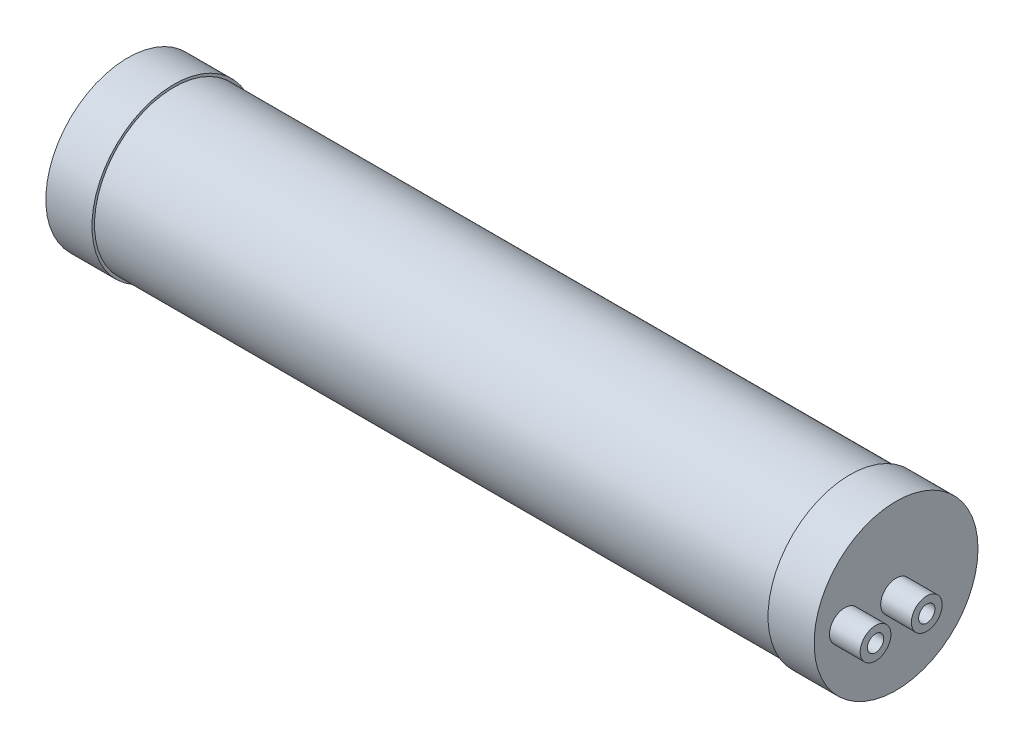
ISO-10303-21;
HEADER;
FILE_DESCRIPTION(('STEP AP214'),'2;1');
FILE_NAME('part.step','',(''),(''),'','','');
FILE_SCHEMA(('AUTOMOTIVE_DESIGN { 1 0 10303 214 1 1 1 1 }'));
ENDSEC;
DATA;
#1=APPLICATION_CONTEXT('core data for automotive mechanical design processes');
#2=APPLICATION_PROTOCOL_DEFINITION('international standard','automotive_design',2000,#1);
#3=PRODUCT_CONTEXT('',#1,'mechanical');
#4=PRODUCT('Part','Part','',(#3));
#5=PRODUCT_RELATED_PRODUCT_CATEGORY('part','',(#4));
#6=PRODUCT_DEFINITION_FORMATION('','',#4);
#7=PRODUCT_DEFINITION_CONTEXT('part definition',#1,'design');
#8=PRODUCT_DEFINITION('design','',#6,#7);
#9=PRODUCT_DEFINITION_SHAPE('','',#8);
#10=(LENGTH_UNIT() NAMED_UNIT(*) SI_UNIT(.MILLI.,.METRE.));
#11=(NAMED_UNIT(*) PLANE_ANGLE_UNIT() SI_UNIT($,.RADIAN.));
#12=(NAMED_UNIT(*) SI_UNIT($,.STERADIAN.) SOLID_ANGLE_UNIT());
#13=UNCERTAINTY_MEASURE_WITH_UNIT(LENGTH_MEASURE(1.E-05),#10,'distance_accuracy_value','');
#14=(GEOMETRIC_REPRESENTATION_CONTEXT(3) GLOBAL_UNCERTAINTY_ASSIGNED_CONTEXT((#13)) GLOBAL_UNIT_ASSIGNED_CONTEXT((#10,
#11,#12)) REPRESENTATION_CONTEXT('',''));
#15=CARTESIAN_POINT('',(0.,0.,0.));
#16=DIRECTION('',(0.,0.,1.));
#17=DIRECTION('',(1.,0.,0.));
#18=AXIS2_PLACEMENT_3D('',#15,#16,#17);
#19=CARTESIAN_POINT('',(150.,0.,0.));
#20=DIRECTION('',(-1.,0.,0.));
#21=DIRECTION('',(0.,0.,1.));
#22=AXIS2_PLACEMENT_3D('',#19,#20,#21);
#23=CYLINDRICAL_SURFACE('',#22,31.);
#24=CARTESIAN_POINT('',(-132.,0.,0.));
#25=DIRECTION('',(1.,0.,0.));
#26=DIRECTION('',(0.,0.,-1.));
#27=AXIS2_PLACEMENT_3D('',#24,#25,#26);
#28=CIRCLE('',#27,31.);
#29=CARTESIAN_POINT('',(-132.,0.,-31.));
#30=VERTEX_POINT('',#29);
#31=EDGE_CURVE('E58',#30,#30,#28,.T.);
#32=ORIENTED_EDGE('',*,*,#31,.T.);
#33=EDGE_LOOP('',(#32));
#34=FACE_BOUND('',#33,.T.);
#35=CARTESIAN_POINT('',(132.,0.,0.));
#36=DIRECTION('',(1.,0.,0.));
#37=DIRECTION('',(0.,0.,-1.));
#38=AXIS2_PLACEMENT_3D('',#35,#36,#37);
#39=CIRCLE('',#38,31.);
#40=CARTESIAN_POINT('',(132.,0.,-31.));
#41=VERTEX_POINT('',#40);
#42=EDGE_CURVE('E49',#41,#41,#39,.T.);
#43=ORIENTED_EDGE('',*,*,#42,.F.);
#44=EDGE_LOOP('',(#43));
#45=FACE_BOUND('',#44,.T.);
#46=ADVANCED_FACE('F50',(#34,#45),#23,.T.);
#47=CARTESIAN_POINT('',(-132.,0.,0.));
#48=DIRECTION('',(-1.,0.,0.));
#49=DIRECTION('',(0.,0.,1.));
#50=AXIS2_PLACEMENT_3D('',#47,#48,#49);
#51=CYLINDRICAL_SURFACE('',#50,32.);
#52=CARTESIAN_POINT('',(-132.,0.,0.));
#53=DIRECTION('',(1.,0.,0.));
#54=DIRECTION('',(0.,0.,-1.));
#55=AXIS2_PLACEMENT_3D('',#52,#53,#54);
#56=CIRCLE('',#55,32.);
#57=CARTESIAN_POINT('',(-132.,0.,-32.));
#58=VERTEX_POINT('',#57);
#59=EDGE_CURVE('E89',#58,#58,#56,.T.);
#60=ORIENTED_EDGE('',*,*,#59,.F.);
#61=EDGE_LOOP('',(#60));
#62=FACE_BOUND('',#61,.T.);
#63=CARTESIAN_POINT('',(-150.,0.,0.));
#64=DIRECTION('',(1.,0.,0.));
#65=DIRECTION('',(0.,0.,-1.));
#66=AXIS2_PLACEMENT_3D('',#63,#64,#65);
#67=CIRCLE('',#66,32.);
#68=CARTESIAN_POINT('',(-150.,0.,-32.));
#69=VERTEX_POINT('',#68);
#70=EDGE_CURVE('E88',#69,#69,#67,.T.);
#71=ORIENTED_EDGE('',*,*,#70,.T.);
#72=EDGE_LOOP('',(#71));
#73=FACE_BOUND('',#72,.T.);
#74=ADVANCED_FACE('F106',(#62,#73),#51,.T.);
#75=CARTESIAN_POINT('',(-132.,0.,0.));
#76=DIRECTION('',(1.,0.,0.));
#77=DIRECTION('',(0.,0.,-1.));
#78=AXIS2_PLACEMENT_3D('',#75,#76,#77);
#79=PLANE('',#78);
#80=ORIENTED_EDGE('',*,*,#31,.F.);
#81=EDGE_LOOP('',(#80));
#82=FACE_BOUND('',#81,.T.);
#83=ORIENTED_EDGE('',*,*,#59,.T.);
#84=EDGE_LOOP('',(#83));
#85=FACE_BOUND('',#84,.T.);
#86=ADVANCED_FACE('F105',(#82,#85),#79,.T.);
#87=CARTESIAN_POINT('',(-150.,0.,0.));
#88=DIRECTION('',(1.,0.,0.));
#89=DIRECTION('',(0.,0.,-1.));
#90=AXIS2_PLACEMENT_3D('',#87,#88,#89);
#91=PLANE('',#90);
#92=CARTESIAN_POINT('',(-150.,0.,0.));
#93=DIRECTION('',(1.,0.,0.));
#94=DIRECTION('',(0.,0.,-1.));
#95=AXIS2_PLACEMENT_3D('',#92,#93,#94);
#96=CIRCLE('',#95,6.);
#97=CARTESIAN_POINT('',(-150.,0.,-6.));
#98=VERTEX_POINT('',#97);
#99=EDGE_CURVE('E74',#98,#98,#96,.T.);
#100=ORIENTED_EDGE('',*,*,#99,.T.);
#101=EDGE_LOOP('',(#100));
#102=FACE_BOUND('',#101,.T.);
#103=ORIENTED_EDGE('',*,*,#70,.F.);
#104=EDGE_LOOP('',(#103));
#105=FACE_BOUND('',#104,.T.);
#106=ADVANCED_FACE('F104',(#102,#105),#91,.F.);
#107=CARTESIAN_POINT('',(150.,0.,0.));
#108=DIRECTION('',(-1.,0.,0.));
#109=DIRECTION('',(0.,0.,1.));
#110=AXIS2_PLACEMENT_3D('',#107,#108,#109);
#111=CYLINDRICAL_SURFACE('',#110,32.);
#112=CARTESIAN_POINT('',(150.,0.,0.));
#113=DIRECTION('',(1.,0.,0.));
#114=DIRECTION('',(0.,0.,-1.));
#115=AXIS2_PLACEMENT_3D('',#112,#113,#114);
#116=CIRCLE('',#115,32.);
#117=CARTESIAN_POINT('',(150.,0.,-32.));
#118=VERTEX_POINT('',#117);
#119=EDGE_CURVE('E85',#118,#118,#116,.T.);
#120=ORIENTED_EDGE('',*,*,#119,.F.);
#121=EDGE_LOOP('',(#120));
#122=FACE_BOUND('',#121,.T.);
#123=CARTESIAN_POINT('',(132.,0.,0.));
#124=DIRECTION('',(1.,0.,0.));
#125=DIRECTION('',(0.,0.,-1.));
#126=AXIS2_PLACEMENT_3D('',#123,#124,#125);
#127=CIRCLE('',#126,32.);
#128=CARTESIAN_POINT('',(132.,0.,-32.));
#129=VERTEX_POINT('',#128);
#130=EDGE_CURVE('E80',#129,#129,#127,.T.);
#131=ORIENTED_EDGE('',*,*,#130,.T.);
#132=EDGE_LOOP('',(#131));
#133=FACE_BOUND('',#132,.T.);
#134=ADVANCED_FACE('F117',(#122,#133),#111,.T.);
#135=CARTESIAN_POINT('',(132.,0.,0.));
#136=DIRECTION('',(1.,0.,0.));
#137=DIRECTION('',(0.,0.,-1.));
#138=AXIS2_PLACEMENT_3D('',#135,#136,#137);
#139=PLANE('',#138);
#140=ORIENTED_EDGE('',*,*,#42,.T.);
#141=EDGE_LOOP('',(#140));
#142=FACE_BOUND('',#141,.T.);
#143=ORIENTED_EDGE('',*,*,#130,.F.);
#144=EDGE_LOOP('',(#143));
#145=FACE_BOUND('',#144,.T.);
#146=ADVANCED_FACE('F124',(#142,#145),#139,.F.);
#147=CARTESIAN_POINT('',(150.,0.,0.));
#148=DIRECTION('',(1.,0.,0.));
#149=DIRECTION('',(0.,0.,-1.));
#150=AXIS2_PLACEMENT_3D('',#147,#148,#149);
#151=PLANE('',#150);
#152=CARTESIAN_POINT('',(150.,0.,20.));
#153=DIRECTION('',(1.,0.,0.));
#154=DIRECTION('',(0.,0.,-1.));
#155=AXIS2_PLACEMENT_3D('',#152,#153,#154);
#156=CIRCLE('',#155,6.);
#157=CARTESIAN_POINT('',(150.,0.,14.));
#158=VERTEX_POINT('',#157);
#159=EDGE_CURVE('E316',#158,#158,#156,.T.);
#160=ORIENTED_EDGE('',*,*,#159,.F.);
#161=EDGE_LOOP('',(#160));
#162=FACE_BOUND('',#161,.T.);
#163=CARTESIAN_POINT('',(150.,0.,0.));
#164=DIRECTION('',(1.,0.,0.));
#165=DIRECTION('',(0.,0.,-1.));
#166=AXIS2_PLACEMENT_3D('',#163,#164,#165);
#167=CIRCLE('',#166,6.);
#168=CARTESIAN_POINT('',(150.,0.,-6.));
#169=VERTEX_POINT('',#168);
#170=EDGE_CURVE('E10',#169,#169,#167,.T.);
#171=ORIENTED_EDGE('',*,*,#170,.F.);
#172=EDGE_LOOP('',(#171));
#173=FACE_BOUND('',#172,.T.);
#174=ORIENTED_EDGE('',*,*,#119,.T.);
#175=EDGE_LOOP('',(#174));
#176=FACE_BOUND('',#175,.T.);
#177=ADVANCED_FACE('F147',(#162,#173,#176),#151,.T.);
#178=CARTESIAN_POINT('',(-150.,0.,0.));
#179=DIRECTION('',(-1.,0.,0.));
#180=DIRECTION('',(0.,0.,1.));
#181=AXIS2_PLACEMENT_3D('',#178,#179,#180);
#182=CYLINDRICAL_SURFACE('',#181,6.);
#183=ORIENTED_EDGE('',*,*,#99,.F.);
#184=EDGE_LOOP('',(#183));
#185=FACE_BOUND('',#184,.T.);
#186=CARTESIAN_POINT('',(-162.,0.,0.));
#187=DIRECTION('',(1.,0.,0.));
#188=DIRECTION('',(0.,0.,-1.));
#189=AXIS2_PLACEMENT_3D('',#186,#187,#188);
#190=CIRCLE('',#189,6.);
#191=CARTESIAN_POINT('',(-162.,0.,-6.));
#192=VERTEX_POINT('',#191);
#193=EDGE_CURVE('E66',#192,#192,#190,.T.);
#194=ORIENTED_EDGE('',*,*,#193,.T.);
#195=EDGE_LOOP('',(#194));
#196=FACE_BOUND('',#195,.T.);
#197=ADVANCED_FACE('F190',(#185,#196),#182,.T.);
#198=CARTESIAN_POINT('',(-162.,0.,0.));
#199=DIRECTION('',(1.,0.,0.));
#200=DIRECTION('',(0.,0.,-1.));
#201=AXIS2_PLACEMENT_3D('',#198,#199,#200);
#202=PLANE('',#201);
#203=CARTESIAN_POINT('',(-162.,0.,0.));
#204=DIRECTION('',(1.,0.,0.));
#205=DIRECTION('',(0.,0.,-1.));
#206=AXIS2_PLACEMENT_3D('',#203,#204,#205);
#207=CIRCLE('',#206,3.2);
#208=CARTESIAN_POINT('',(-162.,0.,-3.2));
#209=VERTEX_POINT('',#208);
#210=EDGE_CURVE('E68',#209,#209,#207,.T.);
#211=ORIENTED_EDGE('',*,*,#210,.T.);
#212=EDGE_LOOP('',(#211));
#213=FACE_BOUND('',#212,.T.);
#214=ORIENTED_EDGE('',*,*,#193,.F.);
#215=EDGE_LOOP('',(#214));
#216=FACE_BOUND('',#215,.T.);
#217=ADVANCED_FACE('F203',(#213,#216),#202,.F.);
#218=CARTESIAN_POINT('',(-152.,0.,0.));
#219=DIRECTION('',(-1.,0.,0.));
#220=DIRECTION('',(0.,0.,1.));
#221=AXIS2_PLACEMENT_3D('',#218,#219,#220);
#222=CYLINDRICAL_SURFACE('',#221,3.2);
#223=CARTESIAN_POINT('',(-152.,0.,0.));
#224=DIRECTION('',(1.,0.,0.));
#225=DIRECTION('',(0.,0.,-1.));
#226=AXIS2_PLACEMENT_3D('',#223,#224,#225);
#227=CIRCLE('',#226,3.2);
#228=CARTESIAN_POINT('',(-152.,0.,-3.2));
#229=VERTEX_POINT('',#228);
#230=EDGE_CURVE('E63',#229,#229,#227,.T.);
#231=ORIENTED_EDGE('',*,*,#230,.T.);
#232=EDGE_LOOP('',(#231));
#233=FACE_BOUND('',#232,.T.);
#234=ORIENTED_EDGE('',*,*,#210,.F.);
#235=EDGE_LOOP('',(#234));
#236=FACE_BOUND('',#235,.T.);
#237=ADVANCED_FACE('F211',(#233,#236),#222,.F.);
#238=CARTESIAN_POINT('',(-152.,0.,0.));
#239=DIRECTION('',(1.,0.,0.));
#240=DIRECTION('',(0.,0.,-1.));
#241=AXIS2_PLACEMENT_3D('',#238,#239,#240);
#242=PLANE('',#241);
#243=ORIENTED_EDGE('',*,*,#230,.F.);
#244=EDGE_LOOP('',(#243));
#245=FACE_BOUND('',#244,.T.);
#246=ADVANCED_FACE('F222',(#245),#242,.F.);
#247=CARTESIAN_POINT('',(162.,0.,0.));
#248=DIRECTION('',(-1.,0.,0.));
#249=DIRECTION('',(0.,0.,1.));
#250=AXIS2_PLACEMENT_3D('',#247,#248,#249);
#251=CYLINDRICAL_SURFACE('',#250,6.);
#252=CARTESIAN_POINT('',(162.,0.,0.));
#253=DIRECTION('',(1.,0.,0.));
#254=DIRECTION('',(0.,0.,-1.));
#255=AXIS2_PLACEMENT_3D('',#252,#253,#254);
#256=CIRCLE('',#255,6.);
#257=CARTESIAN_POINT('',(162.,0.,-6.));
#258=VERTEX_POINT('',#257);
#259=EDGE_CURVE('E65',#258,#258,#256,.T.);
#260=ORIENTED_EDGE('',*,*,#259,.F.);
#261=EDGE_LOOP('',(#260));
#262=FACE_BOUND('',#261,.T.);
#263=ORIENTED_EDGE('',*,*,#170,.T.);
#264=EDGE_LOOP('',(#263));
#265=FACE_BOUND('',#264,.T.);
#266=ADVANCED_FACE('F232',(#262,#265),#251,.T.);
#267=CARTESIAN_POINT('',(162.,0.,0.));
#268=DIRECTION('',(1.,0.,0.));
#269=DIRECTION('',(0.,0.,-1.));
#270=AXIS2_PLACEMENT_3D('',#267,#268,#269);
#271=PLANE('',#270);
#272=CARTESIAN_POINT('',(162.,0.,0.));
#273=DIRECTION('',(1.,0.,0.));
#274=DIRECTION('',(0.,0.,-1.));
#275=AXIS2_PLACEMENT_3D('',#272,#273,#274);
#276=CIRCLE('',#275,3.2);
#277=CARTESIAN_POINT('',(162.,0.,-3.2));
#278=VERTEX_POINT('',#277);
#279=EDGE_CURVE('E328',#278,#278,#276,.T.);
#280=ORIENTED_EDGE('',*,*,#279,.F.);
#281=EDGE_LOOP('',(#280));
#282=FACE_BOUND('',#281,.T.);
#283=ORIENTED_EDGE('',*,*,#259,.T.);
#284=EDGE_LOOP('',(#283));
#285=FACE_BOUND('',#284,.T.);
#286=ADVANCED_FACE('F242',(#282,#285),#271,.T.);
#287=CARTESIAN_POINT('',(152.,0.,0.));
#288=DIRECTION('',(1.,0.,0.));
#289=DIRECTION('',(0.,0.,-1.));
#290=AXIS2_PLACEMENT_3D('',#287,#288,#289);
#291=CYLINDRICAL_SURFACE('',#290,3.2);
#292=CARTESIAN_POINT('',(152.,0.,0.));
#293=DIRECTION('',(1.,0.,0.));
#294=DIRECTION('',(0.,0.,-1.));
#295=AXIS2_PLACEMENT_3D('',#292,#293,#294);
#296=CIRCLE('',#295,3.2);
#297=CARTESIAN_POINT('',(152.,0.,-3.2));
#298=VERTEX_POINT('',#297);
#299=EDGE_CURVE('E332',#298,#298,#296,.T.);
#300=ORIENTED_EDGE('',*,*,#299,.F.);
#301=EDGE_LOOP('',(#300));
#302=FACE_BOUND('',#301,.T.);
#303=ORIENTED_EDGE('',*,*,#279,.T.);
#304=EDGE_LOOP('',(#303));
#305=FACE_BOUND('',#304,.T.);
#306=ADVANCED_FACE('F253',(#302,#305),#291,.F.);
#307=CARTESIAN_POINT('',(152.,0.,0.));
#308=DIRECTION('',(1.,0.,0.));
#309=DIRECTION('',(0.,0.,-1.));
#310=AXIS2_PLACEMENT_3D('',#307,#308,#309);
#311=PLANE('',#310);
#312=ORIENTED_EDGE('',*,*,#299,.T.);
#313=EDGE_LOOP('',(#312));
#314=FACE_BOUND('',#313,.T.);
#315=ADVANCED_FACE('F261',(#314),#311,.T.);
#316=CARTESIAN_POINT('',(162.,0.,20.));
#317=DIRECTION('',(-1.,0.,0.));
#318=DIRECTION('',(0.,0.,1.));
#319=AXIS2_PLACEMENT_3D('',#316,#317,#318);
#320=CYLINDRICAL_SURFACE('',#319,6.);
#321=CARTESIAN_POINT('',(162.,0.,20.));
#322=DIRECTION('',(1.,0.,0.));
#323=DIRECTION('',(0.,0.,-1.));
#324=AXIS2_PLACEMENT_3D('',#321,#322,#323);
#325=CIRCLE('',#324,6.);
#326=CARTESIAN_POINT('',(162.,0.,14.));
#327=VERTEX_POINT('',#326);
#328=EDGE_CURVE('E325',#327,#327,#325,.T.);
#329=ORIENTED_EDGE('',*,*,#328,.F.);
#330=EDGE_LOOP('',(#329));
#331=FACE_BOUND('',#330,.T.);
#332=ORIENTED_EDGE('',*,*,#159,.T.);
#333=EDGE_LOOP('',(#332));
#334=FACE_BOUND('',#333,.T.);
#335=ADVANCED_FACE('F269',(#331,#334),#320,.T.);
#336=CARTESIAN_POINT('',(162.,0.,20.));
#337=DIRECTION('',(1.,0.,0.));
#338=DIRECTION('',(0.,0.,-1.));
#339=AXIS2_PLACEMENT_3D('',#336,#337,#338);
#340=PLANE('',#339);
#341=CARTESIAN_POINT('',(162.,0.,20.));
#342=DIRECTION('',(1.,0.,0.));
#343=DIRECTION('',(0.,0.,-1.));
#344=AXIS2_PLACEMENT_3D('',#341,#342,#343);
#345=CIRCLE('',#344,3.2);
#346=CARTESIAN_POINT('',(162.,0.,16.8));
#347=VERTEX_POINT('',#346);
#348=EDGE_CURVE('E320',#347,#347,#345,.T.);
#349=ORIENTED_EDGE('',*,*,#348,.F.);
#350=EDGE_LOOP('',(#349));
#351=FACE_BOUND('',#350,.T.);
#352=ORIENTED_EDGE('',*,*,#328,.T.);
#353=EDGE_LOOP('',(#352));
#354=FACE_BOUND('',#353,.T.);
#355=ADVANCED_FACE('F276',(#351,#354),#340,.T.);
#356=CARTESIAN_POINT('',(152.,0.,20.));
#357=DIRECTION('',(1.,0.,0.));
#358=DIRECTION('',(0.,0.,-1.));
#359=AXIS2_PLACEMENT_3D('',#356,#357,#358);
#360=CYLINDRICAL_SURFACE('',#359,3.2);
#361=CARTESIAN_POINT('',(152.,0.,20.));
#362=DIRECTION('',(1.,0.,0.));
#363=DIRECTION('',(0.,0.,-1.));
#364=AXIS2_PLACEMENT_3D('',#361,#362,#363);
#365=CIRCLE('',#364,3.2);
#366=CARTESIAN_POINT('',(152.,0.,16.8));
#367=VERTEX_POINT('',#366);
#368=EDGE_CURVE('E314',#367,#367,#365,.T.);
#369=ORIENTED_EDGE('',*,*,#368,.F.);
#370=EDGE_LOOP('',(#369));
#371=FACE_BOUND('',#370,.T.);
#372=ORIENTED_EDGE('',*,*,#348,.T.);
#373=EDGE_LOOP('',(#372));
#374=FACE_BOUND('',#373,.T.);
#375=ADVANCED_FACE('F286',(#371,#374),#360,.F.);
#376=CARTESIAN_POINT('',(152.,0.,20.));
#377=DIRECTION('',(1.,0.,0.));
#378=DIRECTION('',(0.,0.,-1.));
#379=AXIS2_PLACEMENT_3D('',#376,#377,#378);
#380=PLANE('',#379);
#381=ORIENTED_EDGE('',*,*,#368,.T.);
#382=EDGE_LOOP('',(#381));
#383=FACE_BOUND('',#382,.T.);
#384=ADVANCED_FACE('F296',(#383),#380,.T.);
#385=CLOSED_SHELL('',(#46,#74,#86,#106,#134,#146,#177,#197,#217,#237,#246,#266,#286,#306,#315,
#335,#355,#375,#384));
#386=MANIFOLD_SOLID_BREP('B2',#385);
#387=ADVANCED_BREP_SHAPE_REPRESENTATION('',(#18,#386),#14);
#388=SHAPE_DEFINITION_REPRESENTATION(#9,#387);
ENDSEC;
END-ISO-10303-21;
